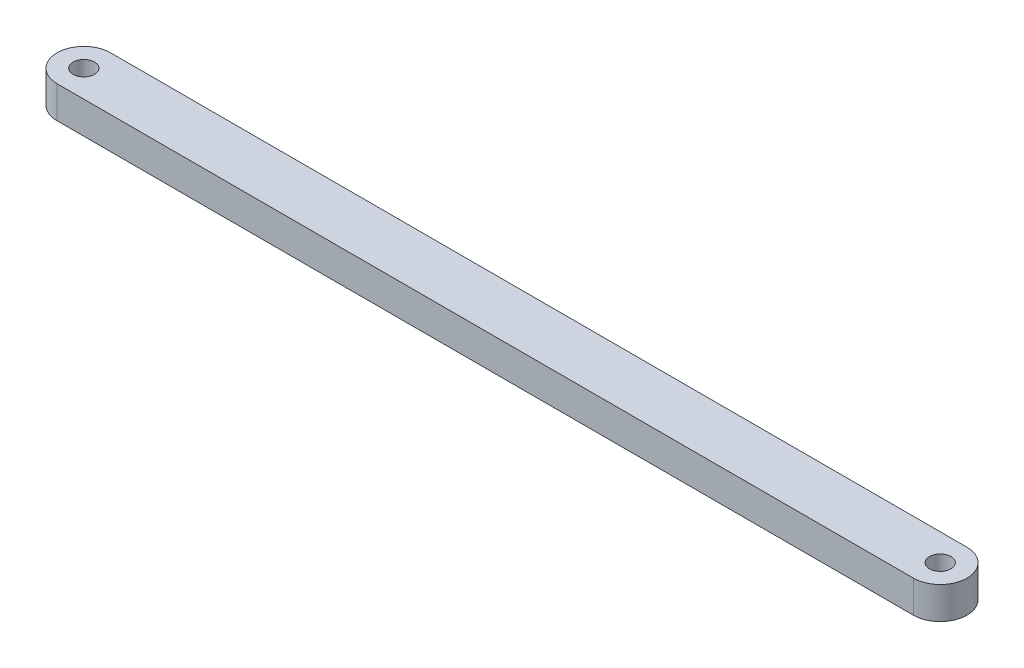
ISO-10303-21;
HEADER;
FILE_DESCRIPTION(('STEP AP214'),'2;1');
FILE_NAME('part.step','',(''),(''),'','','');
FILE_SCHEMA(('AUTOMOTIVE_DESIGN { 1 0 10303 214 1 1 1 1 }'));
ENDSEC;
DATA;
#1=APPLICATION_CONTEXT('core data for automotive mechanical design processes');
#2=APPLICATION_PROTOCOL_DEFINITION('international standard','automotive_design',2000,#1);
#3=PRODUCT_CONTEXT('',#1,'mechanical');
#4=PRODUCT('Part','Part','',(#3));
#5=PRODUCT_RELATED_PRODUCT_CATEGORY('part','',(#4));
#6=PRODUCT_DEFINITION_FORMATION('','',#4);
#7=PRODUCT_DEFINITION_CONTEXT('part definition',#1,'design');
#8=PRODUCT_DEFINITION('design','',#6,#7);
#9=PRODUCT_DEFINITION_SHAPE('','',#8);
#10=(LENGTH_UNIT() NAMED_UNIT(*) SI_UNIT(.MILLI.,.METRE.));
#11=(NAMED_UNIT(*) PLANE_ANGLE_UNIT() SI_UNIT($,.RADIAN.));
#12=(NAMED_UNIT(*) SI_UNIT($,.STERADIAN.) SOLID_ANGLE_UNIT());
#13=UNCERTAINTY_MEASURE_WITH_UNIT(LENGTH_MEASURE(1.E-05),#10,'distance_accuracy_value','');
#14=(GEOMETRIC_REPRESENTATION_CONTEXT(3) GLOBAL_UNCERTAINTY_ASSIGNED_CONTEXT((#13)) GLOBAL_UNIT_ASSIGNED_CONTEXT((#10,
#11,#12)) REPRESENTATION_CONTEXT('',''));
#15=CARTESIAN_POINT('',(0.,0.,0.));
#16=DIRECTION('',(0.,0.,1.));
#17=DIRECTION('',(1.,0.,0.));
#18=AXIS2_PLACEMENT_3D('',#15,#16,#17);
#19=CARTESIAN_POINT('',(0.,30.,0.));
#20=DIRECTION('',(0.,1.,0.));
#21=DIRECTION('',(0.,0.,1.));
#22=AXIS2_PLACEMENT_3D('',#19,#20,#21);
#23=PLANE('',#22);
#24=CARTESIAN_POINT('',(-800.,30.,0.));
#25=DIRECTION('',(0.,1.,0.));
#26=DIRECTION('',(0.,0.,1.));
#27=AXIS2_PLACEMENT_3D('',#24,#25,#26);
#28=CIRCLE('',#27,9.99999999999998);
#29=CARTESIAN_POINT('',(-800.,30.,10.0000000000001));
#30=VERTEX_POINT('',#29);
#31=EDGE_CURVE('E102',#30,#30,#28,.T.);
#32=ORIENTED_EDGE('',*,*,#31,.F.);
#33=EDGE_LOOP('',(#32));
#34=FACE_BOUND('',#33,.T.);
#35=CARTESIAN_POINT('',(0.,30.,0.));
#36=DIRECTION('',(0.,1.,0.));
#37=DIRECTION('',(0.,0.,1.));
#38=AXIS2_PLACEMENT_3D('',#35,#36,#37);
#39=CIRCLE('',#38,25.);
#40=CARTESIAN_POINT('',(0.,30.,25.));
#41=VERTEX_POINT('',#40);
#42=CARTESIAN_POINT('',(0.,30.,-25.));
#43=VERTEX_POINT('',#42);
#44=EDGE_CURVE('E87',#41,#43,#39,.T.);
#45=ORIENTED_EDGE('',*,*,#44,.T.);
#46=DIRECTION('',(-1.,0.,0.));
#47=VECTOR('',#46,1.);
#48=CARTESIAN_POINT('',(0.,30.,-25.));
#49=LINE('',#48,#47);
#50=CARTESIAN_POINT('',(-800.,30.,-24.9999999999999));
#51=VERTEX_POINT('',#50);
#52=EDGE_CURVE('E82',#43,#51,#49,.T.);
#53=ORIENTED_EDGE('',*,*,#52,.T.);
#54=CARTESIAN_POINT('',(-800.,30.,0.));
#55=DIRECTION('',(0.,1.,0.));
#56=DIRECTION('',(0.,0.,1.));
#57=AXIS2_PLACEMENT_3D('',#54,#55,#56);
#58=CIRCLE('',#57,25.);
#59=CARTESIAN_POINT('',(-800.,30.,25.0000000000001));
#60=VERTEX_POINT('',#59);
#61=EDGE_CURVE('E85',#51,#60,#58,.T.);
#62=ORIENTED_EDGE('',*,*,#61,.T.);
#63=DIRECTION('',(1.,0.,0.));
#64=VECTOR('',#63,1.);
#65=CARTESIAN_POINT('',(0.,30.,25.));
#66=LINE('',#65,#64);
#67=EDGE_CURVE('E52',#60,#41,#66,.T.);
#68=ORIENTED_EDGE('',*,*,#67,.T.);
#69=EDGE_LOOP('',(#45,#53,#62,#68));
#70=FACE_BOUND('',#69,.T.);
#71=CARTESIAN_POINT('',(0.,30.,0.));
#72=DIRECTION('',(0.,1.,0.));
#73=DIRECTION('',(0.,0.,1.));
#74=AXIS2_PLACEMENT_3D('',#71,#72,#73);
#75=CIRCLE('',#74,10.);
#76=CARTESIAN_POINT('',(0.,30.,10.));
#77=VERTEX_POINT('',#76);
#78=EDGE_CURVE('E117',#77,#77,#75,.T.);
#79=ORIENTED_EDGE('',*,*,#78,.F.);
#80=EDGE_LOOP('',(#79));
#81=FACE_BOUND('',#80,.T.);
#82=ADVANCED_FACE('F35',(#34,#70,#81),#23,.T.);
#83=CARTESIAN_POINT('',(0.,0.,0.));
#84=DIRECTION('',(0.,1.,0.));
#85=DIRECTION('',(0.,0.,1.));
#86=AXIS2_PLACEMENT_3D('',#83,#84,#85);
#87=PLANE('',#86);
#88=CARTESIAN_POINT('',(0.,0.,0.));
#89=DIRECTION('',(0.,1.,0.));
#90=DIRECTION('',(0.,0.,1.));
#91=AXIS2_PLACEMENT_3D('',#88,#89,#90);
#92=CIRCLE('',#91,25.);
#93=CARTESIAN_POINT('',(0.,0.,25.));
#94=VERTEX_POINT('',#93);
#95=CARTESIAN_POINT('',(0.,0.,-25.));
#96=VERTEX_POINT('',#95);
#97=EDGE_CURVE('E99',#94,#96,#92,.T.);
#98=ORIENTED_EDGE('',*,*,#97,.F.);
#99=DIRECTION('',(1.,0.,0.));
#100=VECTOR('',#99,1.);
#101=CARTESIAN_POINT('',(0.,0.,25.));
#102=LINE('',#101,#100);
#103=CARTESIAN_POINT('',(-800.,0.,25.0000000000001));
#104=VERTEX_POINT('',#103);
#105=EDGE_CURVE('E75',#104,#94,#102,.T.);
#106=ORIENTED_EDGE('',*,*,#105,.F.);
#107=CARTESIAN_POINT('',(-800.,0.,0.));
#108=DIRECTION('',(0.,1.,0.));
#109=DIRECTION('',(0.,0.,1.));
#110=AXIS2_PLACEMENT_3D('',#107,#108,#109);
#111=CIRCLE('',#110,25.);
#112=CARTESIAN_POINT('',(-800.,0.,-24.9999999999999));
#113=VERTEX_POINT('',#112);
#114=EDGE_CURVE('E69',#113,#104,#111,.T.);
#115=ORIENTED_EDGE('',*,*,#114,.F.);
#116=DIRECTION('',(-1.,0.,0.));
#117=VECTOR('',#116,1.);
#118=CARTESIAN_POINT('',(0.,0.,-25.));
#119=LINE('',#118,#117);
#120=EDGE_CURVE('E91',#96,#113,#119,.T.);
#121=ORIENTED_EDGE('',*,*,#120,.F.);
#122=EDGE_LOOP('',(#98,#106,#115,#121));
#123=FACE_BOUND('',#122,.T.);
#124=CARTESIAN_POINT('',(-800.,0.,0.));
#125=DIRECTION('',(0.,1.,0.));
#126=DIRECTION('',(0.,0.,1.));
#127=AXIS2_PLACEMENT_3D('',#124,#125,#126);
#128=CIRCLE('',#127,9.99999999999998);
#129=CARTESIAN_POINT('',(-800.,0.,10.0000000000001));
#130=VERTEX_POINT('',#129);
#131=EDGE_CURVE('E114',#130,#130,#128,.T.);
#132=ORIENTED_EDGE('',*,*,#131,.T.);
#133=EDGE_LOOP('',(#132));
#134=FACE_BOUND('',#133,.T.);
#135=CARTESIAN_POINT('',(0.,0.,0.));
#136=DIRECTION('',(0.,1.,0.));
#137=DIRECTION('',(0.,0.,1.));
#138=AXIS2_PLACEMENT_3D('',#135,#136,#137);
#139=CIRCLE('',#138,10.);
#140=CARTESIAN_POINT('',(0.,0.,10.));
#141=VERTEX_POINT('',#140);
#142=EDGE_CURVE('E120',#141,#141,#139,.T.);
#143=ORIENTED_EDGE('',*,*,#142,.T.);
#144=EDGE_LOOP('',(#143));
#145=FACE_BOUND('',#144,.T.);
#146=ADVANCED_FACE('F110',(#123,#134,#145),#87,.F.);
#147=CARTESIAN_POINT('',(0.,30.,0.));
#148=DIRECTION('',(0.,-1.,0.));
#149=DIRECTION('',(0.,0.,-1.));
#150=AXIS2_PLACEMENT_3D('',#147,#148,#149);
#151=CYLINDRICAL_SURFACE('',#150,25.);
#152=ORIENTED_EDGE('',*,*,#97,.T.);
#153=DIRECTION('',(0.,-1.,0.));
#154=VECTOR('',#153,1.);
#155=CARTESIAN_POINT('',(0.,30.,-25.));
#156=LINE('',#155,#154);
#157=EDGE_CURVE('E11',#43,#96,#156,.T.);
#158=ORIENTED_EDGE('',*,*,#157,.F.);
#159=ORIENTED_EDGE('',*,*,#44,.F.);
#160=DIRECTION('',(0.,-1.,0.));
#161=VECTOR('',#160,1.);
#162=CARTESIAN_POINT('',(0.,30.,25.));
#163=LINE('',#162,#161);
#164=EDGE_CURVE('E95',#41,#94,#163,.T.);
#165=ORIENTED_EDGE('',*,*,#164,.T.);
#166=EDGE_LOOP('',(#152,#158,#159,#165));
#167=FACE_BOUND('',#166,.T.);
#168=ADVANCED_FACE('F37',(#167),#151,.T.);
#169=CARTESIAN_POINT('',(0.,30.,-25.));
#170=DIRECTION('',(0.,0.,1.));
#171=DIRECTION('',(1.,0.,0.));
#172=AXIS2_PLACEMENT_3D('',#169,#170,#171);
#173=PLANE('',#172);
#174=ORIENTED_EDGE('',*,*,#120,.T.);
#175=DIRECTION('',(0.,-1.,0.));
#176=VECTOR('',#175,1.);
#177=CARTESIAN_POINT('',(-800.,30.,-24.9999999999999));
#178=LINE('',#177,#176);
#179=EDGE_CURVE('E44',#51,#113,#178,.T.);
#180=ORIENTED_EDGE('',*,*,#179,.F.);
#181=ORIENTED_EDGE('',*,*,#52,.F.);
#182=ORIENTED_EDGE('',*,*,#157,.T.);
#183=EDGE_LOOP('',(#174,#180,#181,#182));
#184=FACE_BOUND('',#183,.T.);
#185=ADVANCED_FACE('F90',(#184),#173,.F.);
#186=CARTESIAN_POINT('',(-800.,30.,0.));
#187=DIRECTION('',(0.,-1.,0.));
#188=DIRECTION('',(0.,0.,-1.));
#189=AXIS2_PLACEMENT_3D('',#186,#187,#188);
#190=CYLINDRICAL_SURFACE('',#189,25.);
#191=ORIENTED_EDGE('',*,*,#114,.T.);
#192=DIRECTION('',(0.,-1.,0.));
#193=VECTOR('',#192,1.);
#194=CARTESIAN_POINT('',(-800.,30.,25.0000000000001));
#195=LINE('',#194,#193);
#196=EDGE_CURVE('E92',#60,#104,#195,.T.);
#197=ORIENTED_EDGE('',*,*,#196,.F.);
#198=ORIENTED_EDGE('',*,*,#61,.F.);
#199=ORIENTED_EDGE('',*,*,#179,.T.);
#200=EDGE_LOOP('',(#191,#197,#198,#199));
#201=FACE_BOUND('',#200,.T.);
#202=ADVANCED_FACE('F93',(#201),#190,.T.);
#203=CARTESIAN_POINT('',(0.,30.,25.));
#204=DIRECTION('',(0.,0.,-1.));
#205=DIRECTION('',(-1.,0.,0.));
#206=AXIS2_PLACEMENT_3D('',#203,#204,#205);
#207=PLANE('',#206);
#208=ORIENTED_EDGE('',*,*,#105,.T.);
#209=ORIENTED_EDGE('',*,*,#164,.F.);
#210=ORIENTED_EDGE('',*,*,#67,.F.);
#211=ORIENTED_EDGE('',*,*,#196,.T.);
#212=EDGE_LOOP('',(#208,#209,#210,#211));
#213=FACE_BOUND('',#212,.T.);
#214=ADVANCED_FACE('F107',(#213),#207,.F.);
#215=CARTESIAN_POINT('',(-800.,30.,0.));
#216=DIRECTION('',(0.,-1.,0.));
#217=DIRECTION('',(0.,0.,-1.));
#218=AXIS2_PLACEMENT_3D('',#215,#216,#217);
#219=CYLINDRICAL_SURFACE('',#218,9.99999999999998);
#220=ORIENTED_EDGE('',*,*,#31,.T.);
#221=EDGE_LOOP('',(#220));
#222=FACE_BOUND('',#221,.T.);
#223=ORIENTED_EDGE('',*,*,#131,.F.);
#224=EDGE_LOOP('',(#223));
#225=FACE_BOUND('',#224,.T.);
#226=ADVANCED_FACE('F137',(#222,#225),#219,.F.);
#227=CARTESIAN_POINT('',(0.,30.,0.));
#228=DIRECTION('',(0.,-1.,0.));
#229=DIRECTION('',(0.,0.,-1.));
#230=AXIS2_PLACEMENT_3D('',#227,#228,#229);
#231=CYLINDRICAL_SURFACE('',#230,10.);
#232=ORIENTED_EDGE('',*,*,#78,.T.);
#233=EDGE_LOOP('',(#232));
#234=FACE_BOUND('',#233,.T.);
#235=ORIENTED_EDGE('',*,*,#142,.F.);
#236=EDGE_LOOP('',(#235));
#237=FACE_BOUND('',#236,.T.);
#238=ADVANCED_FACE('F126',(#234,#237),#231,.F.);
#239=CLOSED_SHELL('',(#82,#146,#168,#185,#202,#214,#226,#238));
#240=MANIFOLD_SOLID_BREP('B2',#239);
#241=ADVANCED_BREP_SHAPE_REPRESENTATION('',(#18,#240),#14);
#242=SHAPE_DEFINITION_REPRESENTATION(#9,#241);
ENDSEC;
END-ISO-10303-21;
